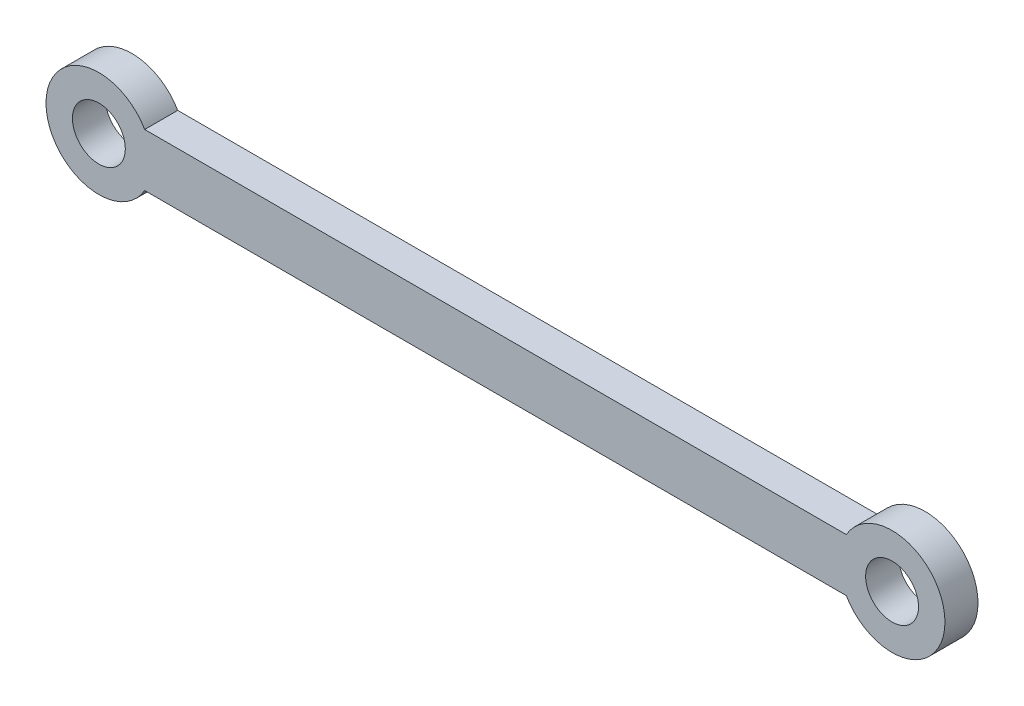
ISO-10303-21;
HEADER;
FILE_DESCRIPTION(('STEP AP214'),'2;1');
FILE_NAME('part.step','',(''),(''),'','','');
FILE_SCHEMA(('AUTOMOTIVE_DESIGN { 1 0 10303 214 1 1 1 1 }'));
ENDSEC;
DATA;
#1=APPLICATION_CONTEXT('core data for automotive mechanical design processes');
#2=APPLICATION_PROTOCOL_DEFINITION('international standard','automotive_design',2000,#1);
#3=PRODUCT_CONTEXT('',#1,'mechanical');
#4=PRODUCT('Part','Part','',(#3));
#5=PRODUCT_RELATED_PRODUCT_CATEGORY('part','',(#4));
#6=PRODUCT_DEFINITION_FORMATION('','',#4);
#7=PRODUCT_DEFINITION_CONTEXT('part definition',#1,'design');
#8=PRODUCT_DEFINITION('design','',#6,#7);
#9=PRODUCT_DEFINITION_SHAPE('','',#8);
#10=(LENGTH_UNIT() NAMED_UNIT(*) SI_UNIT(.MILLI.,.METRE.));
#11=(NAMED_UNIT(*) PLANE_ANGLE_UNIT() SI_UNIT($,.RADIAN.));
#12=(NAMED_UNIT(*) SI_UNIT($,.STERADIAN.) SOLID_ANGLE_UNIT());
#13=UNCERTAINTY_MEASURE_WITH_UNIT(LENGTH_MEASURE(1.E-05),#10,'distance_accuracy_value','');
#14=(GEOMETRIC_REPRESENTATION_CONTEXT(3) GLOBAL_UNCERTAINTY_ASSIGNED_CONTEXT((#13)) GLOBAL_UNIT_ASSIGNED_CONTEXT((#10,
#11,#12)) REPRESENTATION_CONTEXT('',''));
#15=CARTESIAN_POINT('',(0.,0.,0.));
#16=DIRECTION('',(0.,0.,1.));
#17=DIRECTION('',(1.,0.,0.));
#18=AXIS2_PLACEMENT_3D('',#15,#16,#17);
#19=CARTESIAN_POINT('',(0.,2.54,3.175));
#20=DIRECTION('',(0.,0.,-1.));
#21=DIRECTION('',(-1.,0.,0.));
#22=AXIS2_PLACEMENT_3D('',#19,#20,#21);
#23=CYLINDRICAL_SURFACE('',#22,5.08);
#24=CARTESIAN_POINT('',(0.,2.54,0.));
#25=DIRECTION('',(0.,0.,1.));
#26=DIRECTION('',(1.,0.,0.));
#27=AXIS2_PLACEMENT_3D('',#24,#25,#26);
#28=CIRCLE('',#27,5.08);
#29=CARTESIAN_POINT('',(4.39940905122495,5.08,0.));
#30=VERTEX_POINT('',#29);
#31=CARTESIAN_POINT('',(4.39940905122495,0.,0.));
#32=VERTEX_POINT('',#31);
#33=EDGE_CURVE('E109',#30,#32,#28,.T.);
#34=ORIENTED_EDGE('',*,*,#33,.T.);
#35=DIRECTION('',(0.,0.,-1.));
#36=VECTOR('',#35,1.);
#37=CARTESIAN_POINT('',(4.39940905122495,0.,3.175));
#38=LINE('',#37,#36);
#39=CARTESIAN_POINT('',(4.39940905122495,0.,3.175));
#40=VERTEX_POINT('',#39);
#41=EDGE_CURVE('E11',#40,#32,#38,.T.);
#42=ORIENTED_EDGE('',*,*,#41,.F.);
#43=CARTESIAN_POINT('',(0.,2.54,3.175));
#44=DIRECTION('',(0.,0.,1.));
#45=DIRECTION('',(1.,0.,0.));
#46=AXIS2_PLACEMENT_3D('',#43,#44,#45);
#47=CIRCLE('',#46,5.08);
#48=CARTESIAN_POINT('',(4.39940905122495,5.08,3.175));
#49=VERTEX_POINT('',#48);
#50=EDGE_CURVE('E91',#49,#40,#47,.T.);
#51=ORIENTED_EDGE('',*,*,#50,.F.);
#52=DIRECTION('',(0.,0.,-1.));
#53=VECTOR('',#52,1.);
#54=CARTESIAN_POINT('',(4.39940905122495,5.08,3.175));
#55=LINE('',#54,#53);
#56=EDGE_CURVE('E58',#49,#30,#55,.T.);
#57=ORIENTED_EDGE('',*,*,#56,.T.);
#58=EDGE_LOOP('',(#34,#42,#51,#57));
#59=FACE_BOUND('',#58,.T.);
#60=ADVANCED_FACE('F41',(#59),#23,.T.);
#61=CARTESIAN_POINT('',(0.,0.,3.175));
#62=DIRECTION('',(0.,1.,0.));
#63=DIRECTION('',(0.,0.,1.));
#64=AXIS2_PLACEMENT_3D('',#61,#62,#63);
#65=PLANE('',#64);
#66=DIRECTION('',(1.,0.,0.));
#67=VECTOR('',#66,1.);
#68=CARTESIAN_POINT('',(0.,0.,0.));
#69=LINE('',#68,#67);
#70=CARTESIAN_POINT('',(71.8005909487751,0.,0.));
#71=VERTEX_POINT('',#70);
#72=EDGE_CURVE('E97',#32,#71,#69,.T.);
#73=ORIENTED_EDGE('',*,*,#72,.T.);
#74=DIRECTION('',(0.,0.,-1.));
#75=VECTOR('',#74,1.);
#76=CARTESIAN_POINT('',(71.8005909487751,0.,3.175));
#77=LINE('',#76,#75);
#78=CARTESIAN_POINT('',(71.8005909487751,0.,3.175));
#79=VERTEX_POINT('',#78);
#80=EDGE_CURVE('E50',#79,#71,#77,.T.);
#81=ORIENTED_EDGE('',*,*,#80,.F.);
#82=DIRECTION('',(1.,0.,0.));
#83=VECTOR('',#82,1.);
#84=CARTESIAN_POINT('',(0.,0.,3.175));
#85=LINE('',#84,#83);
#86=EDGE_CURVE('E84',#40,#79,#85,.T.);
#87=ORIENTED_EDGE('',*,*,#86,.F.);
#88=ORIENTED_EDGE('',*,*,#41,.T.);
#89=EDGE_LOOP('',(#73,#81,#87,#88));
#90=FACE_BOUND('',#89,.T.);
#91=ADVANCED_FACE('F96',(#90),#65,.F.);
#92=CARTESIAN_POINT('',(76.2,2.54,3.175));
#93=DIRECTION('',(0.,0.,-1.));
#94=DIRECTION('',(-1.,0.,0.));
#95=AXIS2_PLACEMENT_3D('',#92,#93,#94);
#96=CYLINDRICAL_SURFACE('',#95,5.08);
#97=CARTESIAN_POINT('',(76.2,2.54,0.));
#98=DIRECTION('',(0.,0.,1.));
#99=DIRECTION('',(1.,0.,0.));
#100=AXIS2_PLACEMENT_3D('',#97,#98,#99);
#101=CIRCLE('',#100,5.08);
#102=CARTESIAN_POINT('',(71.8005909487751,5.08,0.));
#103=VERTEX_POINT('',#102);
#104=EDGE_CURVE('E115',#71,#103,#101,.T.);
#105=ORIENTED_EDGE('',*,*,#104,.T.);
#106=DIRECTION('',(0.,0.,-1.));
#107=VECTOR('',#106,1.);
#108=CARTESIAN_POINT('',(71.8005909487751,5.08,3.175));
#109=LINE('',#108,#107);
#110=CARTESIAN_POINT('',(71.8005909487751,5.08,3.175));
#111=VERTEX_POINT('',#110);
#112=EDGE_CURVE('E73',#111,#103,#109,.T.);
#113=ORIENTED_EDGE('',*,*,#112,.F.);
#114=CARTESIAN_POINT('',(76.2,2.54,3.175));
#115=DIRECTION('',(0.,0.,1.));
#116=DIRECTION('',(1.,0.,0.));
#117=AXIS2_PLACEMENT_3D('',#114,#115,#116);
#118=CIRCLE('',#117,5.08);
#119=EDGE_CURVE('E90',#79,#111,#118,.T.);
#120=ORIENTED_EDGE('',*,*,#119,.F.);
#121=ORIENTED_EDGE('',*,*,#80,.T.);
#122=EDGE_LOOP('',(#105,#113,#120,#121));
#123=FACE_BOUND('',#122,.T.);
#124=ADVANCED_FACE('F101',(#123),#96,.T.);
#125=CARTESIAN_POINT('',(0.,5.08,3.175));
#126=DIRECTION('',(0.,1.,0.));
#127=DIRECTION('',(0.,0.,1.));
#128=AXIS2_PLACEMENT_3D('',#125,#126,#127);
#129=PLANE('',#128);
#130=DIRECTION('',(1.,0.,0.));
#131=VECTOR('',#130,1.);
#132=CARTESIAN_POINT('',(0.,5.08,0.));
#133=LINE('',#132,#131);
#134=EDGE_CURVE('E118',#30,#103,#133,.T.);
#135=ORIENTED_EDGE('',*,*,#134,.F.);
#136=ORIENTED_EDGE('',*,*,#56,.F.);
#137=DIRECTION('',(1.,0.,0.));
#138=VECTOR('',#137,1.);
#139=CARTESIAN_POINT('',(0.,5.08,3.175));
#140=LINE('',#139,#138);
#141=EDGE_CURVE('E103',#49,#111,#140,.T.);
#142=ORIENTED_EDGE('',*,*,#141,.T.);
#143=ORIENTED_EDGE('',*,*,#112,.T.);
#144=EDGE_LOOP('',(#135,#136,#142,#143));
#145=FACE_BOUND('',#144,.T.);
#146=ADVANCED_FACE('F156',(#145),#129,.T.);
#147=CARTESIAN_POINT('',(0.,0.,3.175));
#148=DIRECTION('',(0.,0.,1.));
#149=DIRECTION('',(1.,0.,0.));
#150=AXIS2_PLACEMENT_3D('',#147,#148,#149);
#151=PLANE('',#150);
#152=CARTESIAN_POINT('',(0.,2.54,3.175));
#153=DIRECTION('',(0.,0.,1.));
#154=DIRECTION('',(1.,0.,0.));
#155=AXIS2_PLACEMENT_3D('',#152,#153,#154);
#156=CIRCLE('',#155,2.54);
#157=CARTESIAN_POINT('',(2.54000000000002,2.54,3.175));
#158=VERTEX_POINT('',#157);
#159=EDGE_CURVE('E136',#158,#158,#156,.T.);
#160=ORIENTED_EDGE('',*,*,#159,.F.);
#161=EDGE_LOOP('',(#160));
#162=FACE_BOUND('',#161,.T.);
#163=CARTESIAN_POINT('',(76.2,2.54,3.175));
#164=DIRECTION('',(0.,0.,1.));
#165=DIRECTION('',(1.,0.,0.));
#166=AXIS2_PLACEMENT_3D('',#163,#164,#165);
#167=CIRCLE('',#166,2.54);
#168=CARTESIAN_POINT('',(78.74,2.54,3.175));
#169=VERTEX_POINT('',#168);
#170=EDGE_CURVE('E128',#169,#169,#167,.T.);
#171=ORIENTED_EDGE('',*,*,#170,.F.);
#172=EDGE_LOOP('',(#171));
#173=FACE_BOUND('',#172,.T.);
#174=ORIENTED_EDGE('',*,*,#50,.T.);
#175=ORIENTED_EDGE('',*,*,#86,.T.);
#176=ORIENTED_EDGE('',*,*,#119,.T.);
#177=ORIENTED_EDGE('',*,*,#141,.F.);
#178=EDGE_LOOP('',(#174,#175,#176,#177));
#179=FACE_BOUND('',#178,.T.);
#180=ADVANCED_FACE('F87',(#162,#173,#179),#151,.T.);
#181=CARTESIAN_POINT('',(0.,0.,0.));
#182=DIRECTION('',(0.,0.,1.));
#183=DIRECTION('',(1.,0.,0.));
#184=AXIS2_PLACEMENT_3D('',#181,#182,#183);
#185=PLANE('',#184);
#186=CARTESIAN_POINT('',(0.,2.54,0.));
#187=DIRECTION('',(0.,0.,1.));
#188=DIRECTION('',(1.,0.,0.));
#189=AXIS2_PLACEMENT_3D('',#186,#187,#188);
#190=CIRCLE('',#189,2.54);
#191=CARTESIAN_POINT('',(2.54000000000002,2.54,0.));
#192=VERTEX_POINT('',#191);
#193=EDGE_CURVE('E112',#192,#192,#190,.T.);
#194=ORIENTED_EDGE('',*,*,#193,.T.);
#195=EDGE_LOOP('',(#194));
#196=FACE_BOUND('',#195,.T.);
#197=CARTESIAN_POINT('',(76.2,2.54,0.));
#198=DIRECTION('',(0.,0.,1.));
#199=DIRECTION('',(1.,0.,0.));
#200=AXIS2_PLACEMENT_3D('',#197,#198,#199);
#201=CIRCLE('',#200,2.54);
#202=CARTESIAN_POINT('',(78.74,2.54,0.));
#203=VERTEX_POINT('',#202);
#204=EDGE_CURVE('E132',#203,#203,#201,.T.);
#205=ORIENTED_EDGE('',*,*,#204,.T.);
#206=EDGE_LOOP('',(#205));
#207=FACE_BOUND('',#206,.T.);
#208=ORIENTED_EDGE('',*,*,#33,.F.);
#209=ORIENTED_EDGE('',*,*,#134,.T.);
#210=ORIENTED_EDGE('',*,*,#104,.F.);
#211=ORIENTED_EDGE('',*,*,#72,.F.);
#212=EDGE_LOOP('',(#208,#209,#210,#211));
#213=FACE_BOUND('',#212,.T.);
#214=ADVANCED_FACE('F144',(#196,#207,#213),#185,.F.);
#215=CARTESIAN_POINT('',(76.2,2.54,0.));
#216=DIRECTION('',(0.,0.,1.));
#217=DIRECTION('',(1.,0.,0.));
#218=AXIS2_PLACEMENT_3D('',#215,#216,#217);
#219=CYLINDRICAL_SURFACE('',#218,2.54);
#220=ORIENTED_EDGE('',*,*,#204,.F.);
#221=EDGE_LOOP('',(#220));
#222=FACE_BOUND('',#221,.T.);
#223=ORIENTED_EDGE('',*,*,#170,.T.);
#224=EDGE_LOOP('',(#223));
#225=FACE_BOUND('',#224,.T.);
#226=ADVANCED_FACE('F150',(#222,#225),#219,.F.);
#227=CARTESIAN_POINT('',(0.,2.54,0.));
#228=DIRECTION('',(0.,0.,1.));
#229=DIRECTION('',(1.,0.,0.));
#230=AXIS2_PLACEMENT_3D('',#227,#228,#229);
#231=CYLINDRICAL_SURFACE('',#230,2.54);
#232=ORIENTED_EDGE('',*,*,#193,.F.);
#233=EDGE_LOOP('',(#232));
#234=FACE_BOUND('',#233,.T.);
#235=ORIENTED_EDGE('',*,*,#159,.T.);
#236=EDGE_LOOP('',(#235));
#237=FACE_BOUND('',#236,.T.);
#238=ADVANCED_FACE('F147',(#234,#237),#231,.F.);
#239=CLOSED_SHELL('',(#60,#91,#124,#146,#180,#214,#226,#238));
#240=MANIFOLD_SOLID_BREP('B2',#239);
#241=ADVANCED_BREP_SHAPE_REPRESENTATION('',(#18,#240),#14);
#242=SHAPE_DEFINITION_REPRESENTATION(#9,#241);
ENDSEC;
END-ISO-10303-21;
